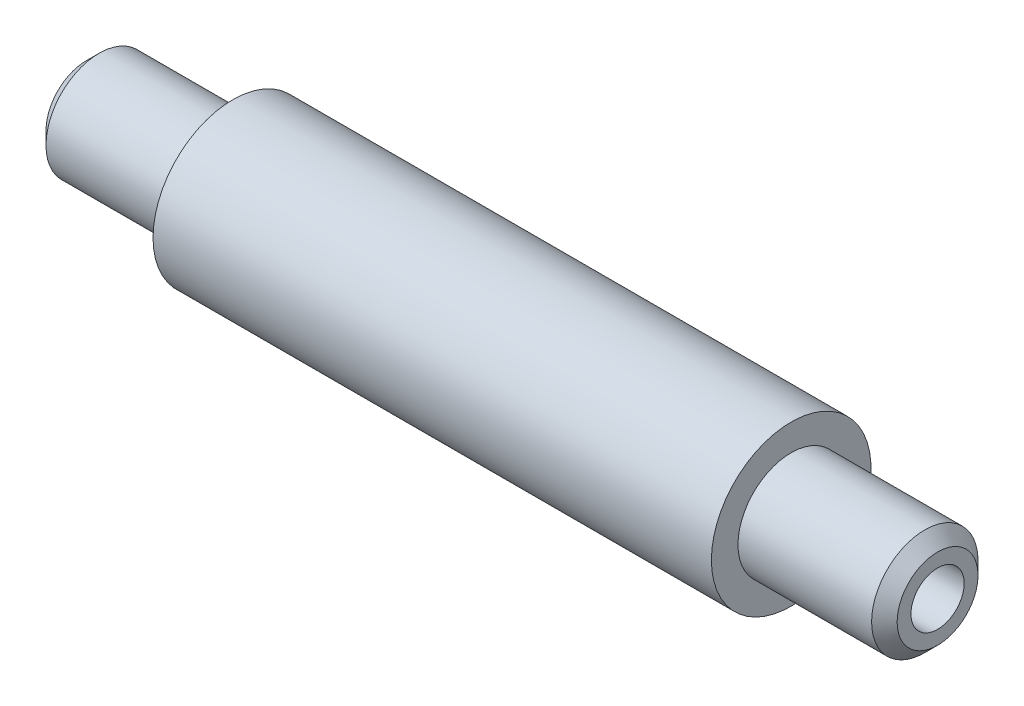
ISO-10303-21;
HEADER;
FILE_DESCRIPTION(('STEP AP214'),'2;1');
FILE_NAME('part.step','',(''),(''),'','','');
FILE_SCHEMA(('AUTOMOTIVE_DESIGN { 1 0 10303 214 1 1 1 1 }'));
ENDSEC;
DATA;
#1=APPLICATION_CONTEXT('core data for automotive mechanical design processes');
#2=APPLICATION_PROTOCOL_DEFINITION('international standard','automotive_design',2000,#1);
#3=PRODUCT_CONTEXT('',#1,'mechanical');
#4=PRODUCT('Part','Part','',(#3));
#5=PRODUCT_RELATED_PRODUCT_CATEGORY('part','',(#4));
#6=PRODUCT_DEFINITION_FORMATION('','',#4);
#7=PRODUCT_DEFINITION_CONTEXT('part definition',#1,'design');
#8=PRODUCT_DEFINITION('design','',#6,#7);
#9=PRODUCT_DEFINITION_SHAPE('','',#8);
#10=(LENGTH_UNIT() NAMED_UNIT(*) SI_UNIT(.MILLI.,.METRE.));
#11=(NAMED_UNIT(*) PLANE_ANGLE_UNIT() SI_UNIT($,.RADIAN.));
#12=(NAMED_UNIT(*) SI_UNIT($,.STERADIAN.) SOLID_ANGLE_UNIT());
#13=UNCERTAINTY_MEASURE_WITH_UNIT(LENGTH_MEASURE(1.E-05),#10,'distance_accuracy_value','');
#14=(GEOMETRIC_REPRESENTATION_CONTEXT(3) GLOBAL_UNCERTAINTY_ASSIGNED_CONTEXT((#13)) GLOBAL_UNIT_ASSIGNED_CONTEXT((#10,
#11,#12)) REPRESENTATION_CONTEXT('',''));
#15=CARTESIAN_POINT('',(0.,0.,0.));
#16=DIRECTION('',(0.,0.,1.));
#17=DIRECTION('',(1.,0.,0.));
#18=AXIS2_PLACEMENT_3D('',#15,#16,#17);
#19=CARTESIAN_POINT('',(-50.8,4.82600000000004,0.));
#20=DIRECTION('',(1.,0.,0.));
#21=DIRECTION('',(0.,0.,-1.));
#22=AXIS2_PLACEMENT_3D('',#19,#20,#21);
#23=PLANE('',#22);
#24=CARTESIAN_POINT('',(-50.8,0.,0.));
#25=DIRECTION('',(-1.,0.,0.));
#26=DIRECTION('',(0.,0.,1.));
#27=AXIS2_PLACEMENT_3D('',#24,#25,#26);
#28=CIRCLE('',#27,3.175);
#29=CARTESIAN_POINT('',(-50.8,0.,3.175));
#30=VERTEX_POINT('',#29);
#31=EDGE_CURVE('E10',#30,#30,#28,.T.);
#32=ORIENTED_EDGE('',*,*,#31,.F.);
#33=EDGE_LOOP('',(#32));
#34=FACE_BOUND('',#33,.T.);
#35=CARTESIAN_POINT('',(-50.8,0.,0.));
#36=DIRECTION('',(-1.,0.,0.));
#37=DIRECTION('',(0.,0.,1.));
#38=AXIS2_PLACEMENT_3D('',#35,#36,#37);
#39=CIRCLE('',#38,4.82600000000004);
#40=CARTESIAN_POINT('',(-50.8,0.,4.82600000000004));
#41=VERTEX_POINT('',#40);
#42=EDGE_CURVE('E67',#41,#41,#39,.T.);
#43=ORIENTED_EDGE('',*,*,#42,.T.);
#44=EDGE_LOOP('',(#43));
#45=FACE_BOUND('',#44,.T.);
#46=ADVANCED_FACE('F33',(#34,#45),#23,.F.);
#47=CARTESIAN_POINT('',(-50.686859688196,0.,0.));
#48=DIRECTION('',(-1.,0.,0.));
#49=DIRECTION('',(0.,0.,1.));
#50=AXIS2_PLACEMENT_3D('',#47,#48,#49);
#51=CYLINDRICAL_SURFACE('',#50,3.175);
#52=CARTESIAN_POINT('',(50.8,0.,0.));
#53=DIRECTION('',(-1.,0.,0.));
#54=DIRECTION('',(0.,0.,1.));
#55=AXIS2_PLACEMENT_3D('',#52,#53,#54);
#56=CIRCLE('',#55,3.175);
#57=CARTESIAN_POINT('',(50.8,0.,3.175));
#58=VERTEX_POINT('',#57);
#59=EDGE_CURVE('E39',#58,#58,#56,.T.);
#60=ORIENTED_EDGE('',*,*,#59,.F.);
#61=EDGE_LOOP('',(#60));
#62=FACE_BOUND('',#61,.T.);
#63=ORIENTED_EDGE('',*,*,#31,.T.);
#64=EDGE_LOOP('',(#63));
#65=FACE_BOUND('',#64,.T.);
#66=ADVANCED_FACE('F116',(#62,#65),#51,.F.);
#67=CARTESIAN_POINT('',(50.8,3.175,0.));
#68=DIRECTION('',(-1.,0.,0.));
#69=DIRECTION('',(0.,0.,1.));
#70=AXIS2_PLACEMENT_3D('',#67,#68,#69);
#71=PLANE('',#70);
#72=CARTESIAN_POINT('',(50.8,0.,0.));
#73=DIRECTION('',(-1.,0.,0.));
#74=DIRECTION('',(0.,0.,1.));
#75=AXIS2_PLACEMENT_3D('',#72,#73,#74);
#76=CIRCLE('',#75,4.82600000000001);
#77=CARTESIAN_POINT('',(50.8,0.,4.82600000000001));
#78=VERTEX_POINT('',#77);
#79=EDGE_CURVE('E43',#78,#78,#76,.T.);
#80=ORIENTED_EDGE('',*,*,#79,.F.);
#81=EDGE_LOOP('',(#80));
#82=FACE_BOUND('',#81,.T.);
#83=ORIENTED_EDGE('',*,*,#59,.T.);
#84=EDGE_LOOP('',(#83));
#85=FACE_BOUND('',#84,.T.);
#86=ADVANCED_FACE('F111',(#82,#85),#71,.F.);
#87=CARTESIAN_POINT('',(50.8,0.,0.));
#88=DIRECTION('',(-1.,0.,0.));
#89=DIRECTION('',(0.,0.,1.));
#90=AXIS2_PLACEMENT_3D('',#87,#88,#89);
#91=CONICAL_SURFACE('',#90,4.82600000000001,0.785398163397446);
#92=CARTESIAN_POINT('',(49.276,0.,0.));
#93=DIRECTION('',(-1.,0.,0.));
#94=DIRECTION('',(0.,0.,1.));
#95=AXIS2_PLACEMENT_3D('',#92,#93,#94);
#96=CIRCLE('',#95,6.35);
#97=CARTESIAN_POINT('',(49.276,0.,6.35));
#98=VERTEX_POINT('',#97);
#99=EDGE_CURVE('E47',#98,#98,#96,.T.);
#100=ORIENTED_EDGE('',*,*,#99,.F.);
#101=EDGE_LOOP('',(#100));
#102=FACE_BOUND('',#101,.T.);
#103=ORIENTED_EDGE('',*,*,#79,.T.);
#104=EDGE_LOOP('',(#103));
#105=FACE_BOUND('',#104,.T.);
#106=ADVANCED_FACE('F105',(#102,#105),#91,.T.);
#107=CARTESIAN_POINT('',(-50.686859688196,0.,0.));
#108=DIRECTION('',(-1.,0.,0.));
#109=DIRECTION('',(0.,0.,1.));
#110=AXIS2_PLACEMENT_3D('',#107,#108,#109);
#111=CYLINDRICAL_SURFACE('',#110,6.35);
#112=CARTESIAN_POINT('',(33.3248,0.,0.));
#113=DIRECTION('',(-1.,0.,0.));
#114=DIRECTION('',(0.,0.,1.));
#115=AXIS2_PLACEMENT_3D('',#112,#113,#114);
#116=CIRCLE('',#115,6.35);
#117=CARTESIAN_POINT('',(33.3248,0.,6.35));
#118=VERTEX_POINT('',#117);
#119=EDGE_CURVE('E52',#118,#118,#116,.T.);
#120=ORIENTED_EDGE('',*,*,#119,.F.);
#121=EDGE_LOOP('',(#120));
#122=FACE_BOUND('',#121,.T.);
#123=ORIENTED_EDGE('',*,*,#99,.T.);
#124=EDGE_LOOP('',(#123));
#125=FACE_BOUND('',#124,.T.);
#126=ADVANCED_FACE('F99',(#122,#125),#111,.T.);
#127=CARTESIAN_POINT('',(33.3248,6.35,0.));
#128=DIRECTION('',(-1.,0.,0.));
#129=DIRECTION('',(0.,0.,1.));
#130=AXIS2_PLACEMENT_3D('',#127,#128,#129);
#131=PLANE('',#130);
#132=CARTESIAN_POINT('',(33.3248,0.,0.));
#133=DIRECTION('',(-1.,0.,0.));
#134=DIRECTION('',(0.,0.,1.));
#135=AXIS2_PLACEMENT_3D('',#132,#133,#134);
#136=CIRCLE('',#135,9.52499999999999);
#137=CARTESIAN_POINT('',(33.3248,0.,9.52499999999999));
#138=VERTEX_POINT('',#137);
#139=EDGE_CURVE('E55',#138,#138,#136,.T.);
#140=ORIENTED_EDGE('',*,*,#139,.F.);
#141=EDGE_LOOP('',(#140));
#142=FACE_BOUND('',#141,.T.);
#143=ORIENTED_EDGE('',*,*,#119,.T.);
#144=EDGE_LOOP('',(#143));
#145=FACE_BOUND('',#144,.T.);
#146=ADVANCED_FACE('F93',(#142,#145),#131,.F.);
#147=CARTESIAN_POINT('',(-50.686859688196,0.,0.));
#148=DIRECTION('',(-1.,0.,0.));
#149=DIRECTION('',(0.,0.,1.));
#150=AXIS2_PLACEMENT_3D('',#147,#148,#149);
#151=CYLINDRICAL_SURFACE('',#150,9.52499999999999);
#152=CARTESIAN_POINT('',(-33.3248,0.,0.));
#153=DIRECTION('',(-1.,0.,0.));
#154=DIRECTION('',(0.,0.,1.));
#155=AXIS2_PLACEMENT_3D('',#152,#153,#154);
#156=CIRCLE('',#155,9.52499999999999);
#157=CARTESIAN_POINT('',(-33.3248,0.,9.52499999999999));
#158=VERTEX_POINT('',#157);
#159=EDGE_CURVE('E58',#158,#158,#156,.T.);
#160=ORIENTED_EDGE('',*,*,#159,.F.);
#161=EDGE_LOOP('',(#160));
#162=FACE_BOUND('',#161,.T.);
#163=ORIENTED_EDGE('',*,*,#139,.T.);
#164=EDGE_LOOP('',(#163));
#165=FACE_BOUND('',#164,.T.);
#166=ADVANCED_FACE('F87',(#162,#165),#151,.T.);
#167=CARTESIAN_POINT('',(-33.3248,9.52499999999999,0.));
#168=DIRECTION('',(1.,0.,0.));
#169=DIRECTION('',(0.,0.,-1.));
#170=AXIS2_PLACEMENT_3D('',#167,#168,#169);
#171=PLANE('',#170);
#172=CARTESIAN_POINT('',(-33.3248,0.,0.));
#173=DIRECTION('',(-1.,0.,0.));
#174=DIRECTION('',(0.,0.,1.));
#175=AXIS2_PLACEMENT_3D('',#172,#173,#174);
#176=CIRCLE('',#175,6.35000000000002);
#177=CARTESIAN_POINT('',(-33.3248,0.,6.35000000000002));
#178=VERTEX_POINT('',#177);
#179=EDGE_CURVE('E61',#178,#178,#176,.T.);
#180=ORIENTED_EDGE('',*,*,#179,.F.);
#181=EDGE_LOOP('',(#180));
#182=FACE_BOUND('',#181,.T.);
#183=ORIENTED_EDGE('',*,*,#159,.T.);
#184=EDGE_LOOP('',(#183));
#185=FACE_BOUND('',#184,.T.);
#186=ADVANCED_FACE('F81',(#182,#185),#171,.F.);
#187=CARTESIAN_POINT('',(-50.686859688196,0.,0.));
#188=DIRECTION('',(-1.,0.,0.));
#189=DIRECTION('',(0.,0.,1.));
#190=AXIS2_PLACEMENT_3D('',#187,#188,#189);
#191=CYLINDRICAL_SURFACE('',#190,6.35000000000002);
#192=CARTESIAN_POINT('',(-49.276,0.,0.));
#193=DIRECTION('',(-1.,0.,0.));
#194=DIRECTION('',(0.,0.,1.));
#195=AXIS2_PLACEMENT_3D('',#192,#193,#194);
#196=CIRCLE('',#195,6.35000000000002);
#197=CARTESIAN_POINT('',(-49.276,0.,6.35000000000002));
#198=VERTEX_POINT('',#197);
#199=EDGE_CURVE('E64',#198,#198,#196,.T.);
#200=ORIENTED_EDGE('',*,*,#199,.F.);
#201=EDGE_LOOP('',(#200));
#202=FACE_BOUND('',#201,.T.);
#203=ORIENTED_EDGE('',*,*,#179,.T.);
#204=EDGE_LOOP('',(#203));
#205=FACE_BOUND('',#204,.T.);
#206=ADVANCED_FACE('F75',(#202,#205),#191,.T.);
#207=CARTESIAN_POINT('',(-49.276,0.,0.));
#208=DIRECTION('',(1.,0.,0.));
#209=DIRECTION('',(0.,0.,-1.));
#210=AXIS2_PLACEMENT_3D('',#207,#208,#209);
#211=CONICAL_SURFACE('',#210,6.35000000000002,0.785398163397449);
#212=ORIENTED_EDGE('',*,*,#42,.F.);
#213=EDGE_LOOP('',(#212));
#214=FACE_BOUND('',#213,.T.);
#215=ORIENTED_EDGE('',*,*,#199,.T.);
#216=EDGE_LOOP('',(#215));
#217=FACE_BOUND('',#216,.T.);
#218=ADVANCED_FACE('F72',(#214,#217),#211,.T.);
#219=CLOSED_SHELL('',(#46,#66,#86,#106,#126,#146,#166,#186,#206,#218));
#220=MANIFOLD_SOLID_BREP('B2',#219);
#221=ADVANCED_BREP_SHAPE_REPRESENTATION('',(#18,#220),#14);
#222=SHAPE_DEFINITION_REPRESENTATION(#9,#221);
ENDSEC;
END-ISO-10303-21;
